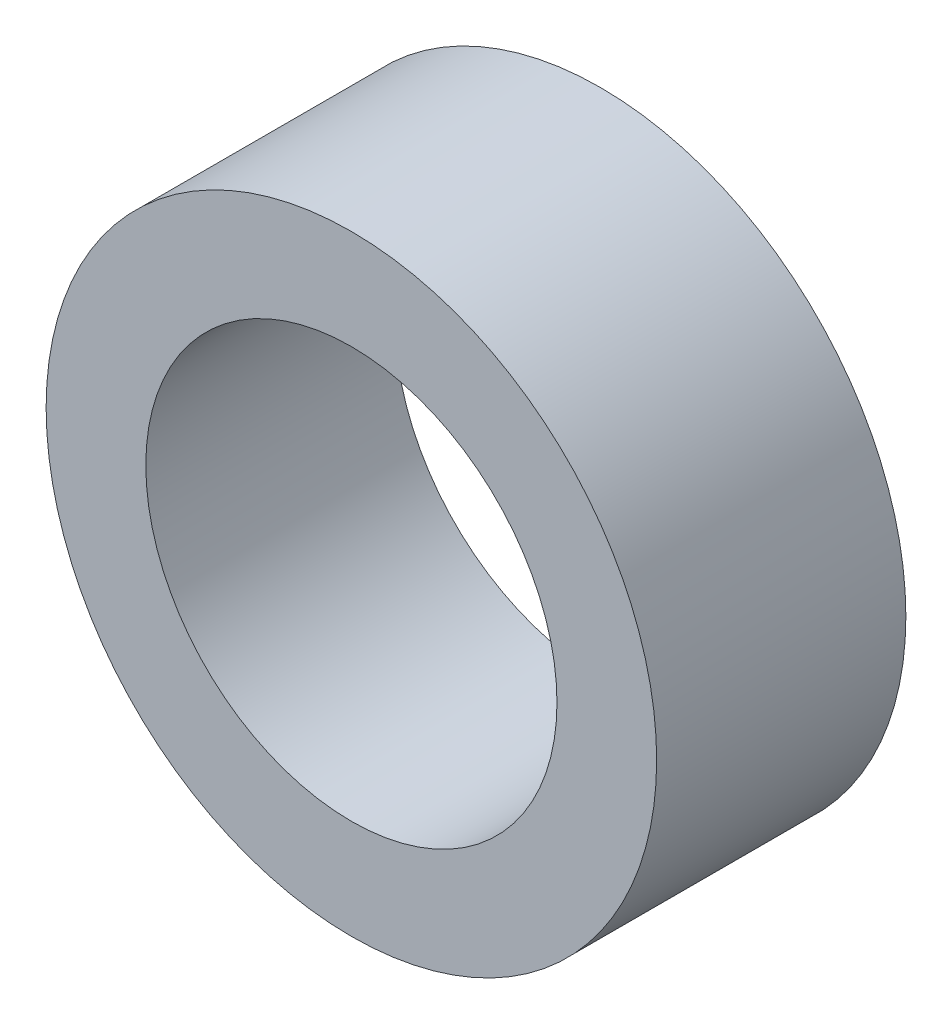
ISO-10303-21;
HEADER;
FILE_DESCRIPTION(('STEP AP214'),'2;1');
FILE_NAME('part.step','',(''),(''),'','','');
FILE_SCHEMA(('AUTOMOTIVE_DESIGN { 1 0 10303 214 1 1 1 1 }'));
ENDSEC;
DATA;
#1=APPLICATION_CONTEXT('core data for automotive mechanical design processes');
#2=APPLICATION_PROTOCOL_DEFINITION('international standard','automotive_design',2000,#1);
#3=PRODUCT_CONTEXT('',#1,'mechanical');
#4=PRODUCT('Part','Part','',(#3));
#5=PRODUCT_RELATED_PRODUCT_CATEGORY('part','',(#4));
#6=PRODUCT_DEFINITION_FORMATION('','',#4);
#7=PRODUCT_DEFINITION_CONTEXT('part definition',#1,'design');
#8=PRODUCT_DEFINITION('design','',#6,#7);
#9=PRODUCT_DEFINITION_SHAPE('','',#8);
#10=(LENGTH_UNIT() NAMED_UNIT(*) SI_UNIT(.MILLI.,.METRE.));
#11=(NAMED_UNIT(*) PLANE_ANGLE_UNIT() SI_UNIT($,.RADIAN.));
#12=(NAMED_UNIT(*) SI_UNIT($,.STERADIAN.) SOLID_ANGLE_UNIT());
#13=UNCERTAINTY_MEASURE_WITH_UNIT(LENGTH_MEASURE(1.E-05),#10,'distance_accuracy_value','');
#14=(GEOMETRIC_REPRESENTATION_CONTEXT(3) GLOBAL_UNCERTAINTY_ASSIGNED_CONTEXT((#13)) GLOBAL_UNIT_ASSIGNED_CONTEXT((#10,
#11,#12)) REPRESENTATION_CONTEXT('',''));
#15=CARTESIAN_POINT('',(0.,0.,0.));
#16=DIRECTION('',(0.,0.,1.));
#17=DIRECTION('',(1.,0.,0.));
#18=AXIS2_PLACEMENT_3D('',#15,#16,#17);
#19=CARTESIAN_POINT('',(0.,0.,20.));
#20=DIRECTION('',(0.,0.,-1.));
#21=DIRECTION('',(-1.,0.,0.));
#22=AXIS2_PLACEMENT_3D('',#19,#20,#21);
#23=CYLINDRICAL_SURFACE('',#22,24.5);
#24=CARTESIAN_POINT('',(0.,0.,20.));
#25=DIRECTION('',(0.,0.,-1.));
#26=DIRECTION('',(1.,0.,0.));
#27=AXIS2_PLACEMENT_3D('',#24,#25,#26);
#28=CIRCLE('',#27,24.5);
#29=CARTESIAN_POINT('',(24.5,0.,20.));
#30=VERTEX_POINT('',#29);
#31=EDGE_CURVE('E10',#30,#30,#28,.T.);
#32=ORIENTED_EDGE('',*,*,#31,.T.);
#33=EDGE_LOOP('',(#32));
#34=FACE_BOUND('',#33,.T.);
#35=CARTESIAN_POINT('',(0.,0.,0.));
#36=DIRECTION('',(0.,0.,-1.));
#37=DIRECTION('',(1.,0.,0.));
#38=AXIS2_PLACEMENT_3D('',#35,#36,#37);
#39=CIRCLE('',#38,24.5);
#40=CARTESIAN_POINT('',(24.5,0.,0.));
#41=VERTEX_POINT('',#40);
#42=EDGE_CURVE('E46',#41,#41,#39,.T.);
#43=ORIENTED_EDGE('',*,*,#42,.F.);
#44=EDGE_LOOP('',(#43));
#45=FACE_BOUND('',#44,.T.);
#46=ADVANCED_FACE('F43',(#34,#45),#23,.T.);
#47=CARTESIAN_POINT('',(0.,0.,20.));
#48=DIRECTION('',(0.,0.,-1.));
#49=DIRECTION('',(-1.,0.,0.));
#50=AXIS2_PLACEMENT_3D('',#47,#48,#49);
#51=PLANE('',#50);
#52=CARTESIAN_POINT('',(0.,0.,20.));
#53=DIRECTION('',(0.,0.,1.));
#54=DIRECTION('',(1.,0.,0.));
#55=AXIS2_PLACEMENT_3D('',#52,#53,#54);
#56=CIRCLE('',#55,16.5);
#57=CARTESIAN_POINT('',(16.5,0.,20.));
#58=VERTEX_POINT('',#57);
#59=EDGE_CURVE('E56',#58,#58,#56,.T.);
#60=ORIENTED_EDGE('',*,*,#59,.F.);
#61=EDGE_LOOP('',(#60));
#62=FACE_BOUND('',#61,.T.);
#63=ORIENTED_EDGE('',*,*,#31,.F.);
#64=EDGE_LOOP('',(#63));
#65=FACE_BOUND('',#64,.T.);
#66=ADVANCED_FACE('F71',(#62,#65),#51,.F.);
#67=CARTESIAN_POINT('',(0.,0.,0.));
#68=DIRECTION('',(0.,0.,-1.));
#69=DIRECTION('',(-1.,0.,0.));
#70=AXIS2_PLACEMENT_3D('',#67,#68,#69);
#71=PLANE('',#70);
#72=CARTESIAN_POINT('',(0.,0.,0.));
#73=DIRECTION('',(0.,0.,1.));
#74=DIRECTION('',(1.,0.,0.));
#75=AXIS2_PLACEMENT_3D('',#72,#73,#74);
#76=CIRCLE('',#75,16.5);
#77=CARTESIAN_POINT('',(16.5,0.,0.));
#78=VERTEX_POINT('',#77);
#79=EDGE_CURVE('E54',#78,#78,#76,.T.);
#80=ORIENTED_EDGE('',*,*,#79,.T.);
#81=EDGE_LOOP('',(#80));
#82=FACE_BOUND('',#81,.T.);
#83=ORIENTED_EDGE('',*,*,#42,.T.);
#84=EDGE_LOOP('',(#83));
#85=FACE_BOUND('',#84,.T.);
#86=ADVANCED_FACE('F62',(#82,#85),#71,.T.);
#87=CARTESIAN_POINT('',(0.,0.,0.));
#88=DIRECTION('',(0.,0.,1.));
#89=DIRECTION('',(1.,0.,0.));
#90=AXIS2_PLACEMENT_3D('',#87,#88,#89);
#91=CYLINDRICAL_SURFACE('',#90,16.5);
#92=ORIENTED_EDGE('',*,*,#79,.F.);
#93=EDGE_LOOP('',(#92));
#94=FACE_BOUND('',#93,.T.);
#95=ORIENTED_EDGE('',*,*,#59,.T.);
#96=EDGE_LOOP('',(#95));
#97=FACE_BOUND('',#96,.T.);
#98=ADVANCED_FACE('F65',(#94,#97),#91,.F.);
#99=CLOSED_SHELL('',(#46,#66,#86,#98));
#100=MANIFOLD_SOLID_BREP('B2',#99);
#101=ADVANCED_BREP_SHAPE_REPRESENTATION('',(#18,#100),#14);
#102=SHAPE_DEFINITION_REPRESENTATION(#9,#101);
ENDSEC;
END-ISO-10303-21;
